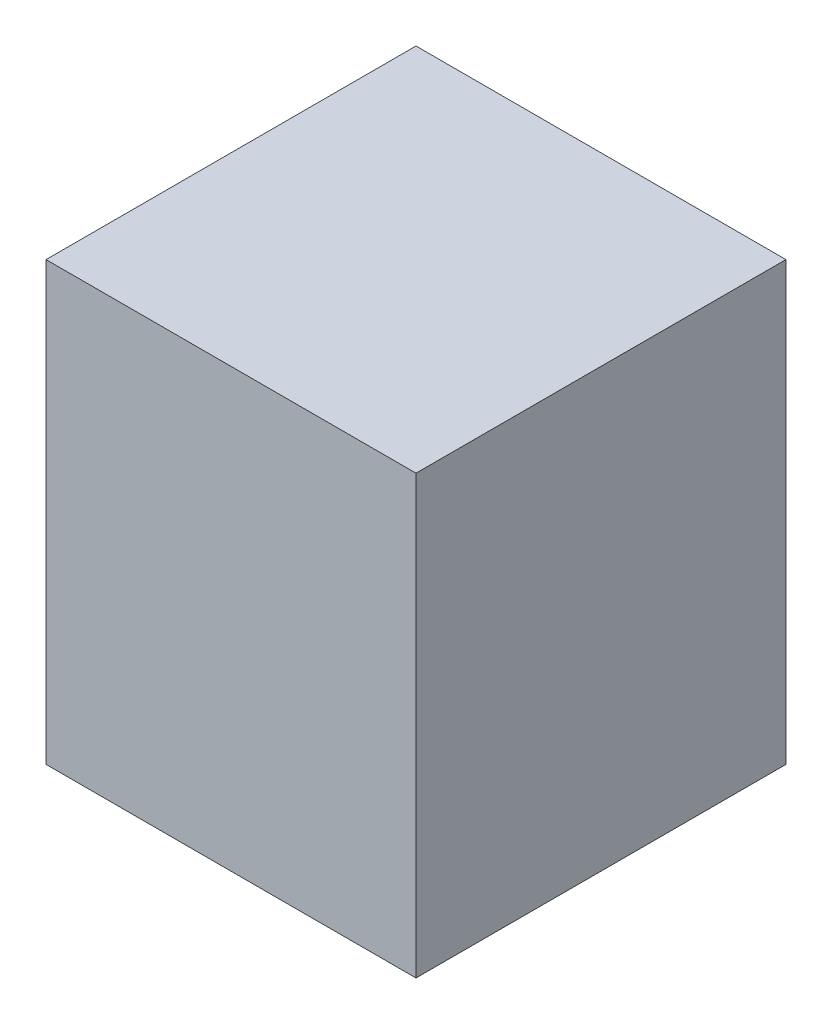
ISO-10303-21;
HEADER;
FILE_DESCRIPTION(('STEP AP214'),'2;1');
FILE_NAME('part.step','',(''),(''),'','','');
FILE_SCHEMA(('AUTOMOTIVE_DESIGN { 1 0 10303 214 1 1 1 1 }'));
ENDSEC;
DATA;
#1=APPLICATION_CONTEXT('core data for automotive mechanical design processes');
#2=APPLICATION_PROTOCOL_DEFINITION('international standard','automotive_design',2000,#1);
#3=PRODUCT_CONTEXT('',#1,'mechanical');
#4=PRODUCT('Part','Part','',(#3));
#5=PRODUCT_RELATED_PRODUCT_CATEGORY('part','',(#4));
#6=PRODUCT_DEFINITION_FORMATION('','',#4);
#7=PRODUCT_DEFINITION_CONTEXT('part definition',#1,'design');
#8=PRODUCT_DEFINITION('design','',#6,#7);
#9=PRODUCT_DEFINITION_SHAPE('','',#8);
#10=(LENGTH_UNIT() NAMED_UNIT(*) SI_UNIT(.MILLI.,.METRE.));
#11=(NAMED_UNIT(*) PLANE_ANGLE_UNIT() SI_UNIT($,.RADIAN.));
#12=(NAMED_UNIT(*) SI_UNIT($,.STERADIAN.) SOLID_ANGLE_UNIT());
#13=UNCERTAINTY_MEASURE_WITH_UNIT(LENGTH_MEASURE(1.E-05),#10,'distance_accuracy_value','');
#14=(GEOMETRIC_REPRESENTATION_CONTEXT(3) GLOBAL_UNCERTAINTY_ASSIGNED_CONTEXT((#13)) GLOBAL_UNIT_ASSIGNED_CONTEXT((#10,
#11,#12)) REPRESENTATION_CONTEXT('',''));
#15=CARTESIAN_POINT('',(0.,0.,0.));
#16=DIRECTION('',(0.,0.,1.));
#17=DIRECTION('',(1.,0.,0.));
#18=AXIS2_PLACEMENT_3D('',#15,#16,#17);
#19=CARTESIAN_POINT('',(27.5,32.5,0.));
#20=DIRECTION('',(0.707106781186546,0.,-0.707106781186549));
#21=DIRECTION('',(-0.707106781186549,0.,-0.707106781186546));
#22=AXIS2_PLACEMENT_3D('',#19,#20,#21);
#23=PLANE('',#22);
#24=DIRECTION('',(0.,1.,0.));
#25=VECTOR('',#24,1.);
#26=CARTESIAN_POINT('',(27.5,32.5,0.));
#27=LINE('',#26,#25);
#28=CARTESIAN_POINT('',(27.5,-32.5,0.));
#29=VERTEX_POINT('',#28);
#30=CARTESIAN_POINT('',(27.5,32.5,0.));
#31=VERTEX_POINT('',#30);
#32=EDGE_CURVE('E126',#29,#31,#27,.T.);
#33=ORIENTED_EDGE('',*,*,#32,.F.);
#34=DIRECTION('',(0.577350269189627,-0.577350269189627,0.577350269189624));
#35=VECTOR('',#34,1.);
#36=CARTESIAN_POINT('',(9.16666666666664,-14.1666666666666,-18.3333333333333));
#37=LINE('',#36,#35);
#38=CARTESIAN_POINT('',(17.5,-22.5,-10.));
#39=VERTEX_POINT('',#38);
#40=EDGE_CURVE('E11',#39,#29,#37,.T.);
#41=ORIENTED_EDGE('',*,*,#40,.F.);
#42=DIRECTION('',(0.,1.,0.));
#43=VECTOR('',#42,1.);
#44=CARTESIAN_POINT('',(17.5,0.,-10.));
#45=LINE('',#44,#43);
#46=CARTESIAN_POINT('',(17.5,22.5,-10.));
#47=VERTEX_POINT('',#46);
#48=EDGE_CURVE('E146',#39,#47,#45,.T.);
#49=ORIENTED_EDGE('',*,*,#48,.T.);
#50=DIRECTION('',(0.577350269189626,0.577350269189627,0.577350269189624));
#51=VECTOR('',#50,1.);
#52=CARTESIAN_POINT('',(27.5,32.5,0.));
#53=LINE('',#52,#51);
#54=EDGE_CURVE('E77',#47,#31,#53,.T.);
#55=ORIENTED_EDGE('',*,*,#54,.T.);
#56=EDGE_LOOP('',(#33,#41,#49,#55));
#57=FACE_BOUND('',#56,.T.);
#58=ADVANCED_FACE('F39',(#57),#23,.T.);
#59=CARTESIAN_POINT('',(-27.5,-32.5,0.));
#60=DIRECTION('',(0.,-0.707106781186546,-0.707106781186549));
#61=DIRECTION('',(0.,0.707106781186549,-0.707106781186546));
#62=AXIS2_PLACEMENT_3D('',#59,#60,#61);
#63=PLANE('',#62);
#64=DIRECTION('',(1.,0.,0.));
#65=VECTOR('',#64,1.);
#66=CARTESIAN_POINT('',(-27.5,-32.5,0.));
#67=LINE('',#66,#65);
#68=CARTESIAN_POINT('',(-27.5,-32.5,0.));
#69=VERTEX_POINT('',#68);
#70=EDGE_CURVE('E143',#69,#29,#67,.T.);
#71=ORIENTED_EDGE('',*,*,#70,.F.);
#72=DIRECTION('',(-0.577350269189626,-0.577350269189627,0.577350269189624));
#73=VECTOR('',#72,1.);
#74=CARTESIAN_POINT('',(-5.83333333333327,-10.8333333333333,-21.6666666666666));
#75=LINE('',#74,#73);
#76=CARTESIAN_POINT('',(-17.5,-22.5,-10.));
#77=VERTEX_POINT('',#76);
#78=EDGE_CURVE('E50',#77,#69,#75,.T.);
#79=ORIENTED_EDGE('',*,*,#78,.F.);
#80=DIRECTION('',(1.,0.,0.));
#81=VECTOR('',#80,1.);
#82=CARTESIAN_POINT('',(0.,-22.5,-10.));
#83=LINE('',#82,#81);
#84=EDGE_CURVE('E150',#77,#39,#83,.T.);
#85=ORIENTED_EDGE('',*,*,#84,.T.);
#86=ORIENTED_EDGE('',*,*,#40,.T.);
#87=EDGE_LOOP('',(#71,#79,#85,#86));
#88=FACE_BOUND('',#87,.T.);
#89=ADVANCED_FACE('F41',(#88),#63,.T.);
#90=CARTESIAN_POINT('',(-27.5,32.5,0.));
#91=DIRECTION('',(-0.707106781186546,0.,-0.707106781186549));
#92=DIRECTION('',(-0.707106781186549,0.,0.707106781186546));
#93=AXIS2_PLACEMENT_3D('',#90,#91,#92);
#94=PLANE('',#93);
#95=DIRECTION('',(0.,-1.,0.));
#96=VECTOR('',#95,1.);
#97=CARTESIAN_POINT('',(-27.5,32.5,0.));
#98=LINE('',#97,#96);
#99=CARTESIAN_POINT('',(-27.5,32.5,0.));
#100=VERTEX_POINT('',#99);
#101=EDGE_CURVE('E139',#100,#69,#98,.T.);
#102=ORIENTED_EDGE('',*,*,#101,.F.);
#103=DIRECTION('',(-0.577350269189627,0.577350269189627,0.577350269189624));
#104=VECTOR('',#103,1.);
#105=CARTESIAN_POINT('',(-27.5,32.5,0.));
#106=LINE('',#105,#104);
#107=CARTESIAN_POINT('',(-17.5,22.5,-10.));
#108=VERTEX_POINT('',#107);
#109=EDGE_CURVE('E70',#108,#100,#106,.T.);
#110=ORIENTED_EDGE('',*,*,#109,.F.);
#111=DIRECTION('',(0.,-1.,0.));
#112=VECTOR('',#111,1.);
#113=CARTESIAN_POINT('',(-17.5,0.,-10.));
#114=LINE('',#113,#112);
#115=EDGE_CURVE('E159',#108,#77,#114,.T.);
#116=ORIENTED_EDGE('',*,*,#115,.T.);
#117=ORIENTED_EDGE('',*,*,#78,.T.);
#118=EDGE_LOOP('',(#102,#110,#116,#117));
#119=FACE_BOUND('',#118,.T.);
#120=ADVANCED_FACE('F182',(#119),#94,.T.);
#121=CARTESIAN_POINT('',(-27.5,32.5,0.));
#122=DIRECTION('',(0.,0.707106781186546,-0.707106781186549));
#123=DIRECTION('',(0.,0.707106781186549,0.707106781186546));
#124=AXIS2_PLACEMENT_3D('',#121,#122,#123);
#125=PLANE('',#124);
#126=DIRECTION('',(-1.,0.,0.));
#127=VECTOR('',#126,1.);
#128=CARTESIAN_POINT('',(-27.5,32.5,0.));
#129=LINE('',#128,#127);
#130=EDGE_CURVE('E131',#31,#100,#129,.T.);
#131=ORIENTED_EDGE('',*,*,#130,.F.);
#132=ORIENTED_EDGE('',*,*,#54,.F.);
#133=DIRECTION('',(-1.,0.,0.));
#134=VECTOR('',#133,1.);
#135=CARTESIAN_POINT('',(0.,22.5,-10.));
#136=LINE('',#135,#134);
#137=EDGE_CURVE('E43',#47,#108,#136,.T.);
#138=ORIENTED_EDGE('',*,*,#137,.T.);
#139=ORIENTED_EDGE('',*,*,#109,.T.);
#140=EDGE_LOOP('',(#131,#132,#138,#139));
#141=FACE_BOUND('',#140,.T.);
#142=ADVANCED_FACE('F163',(#141),#125,.T.);
#143=CARTESIAN_POINT('',(0.,0.,-10.));
#144=DIRECTION('',(0.,0.,1.));
#145=DIRECTION('',(1.,0.,0.));
#146=AXIS2_PLACEMENT_3D('',#143,#144,#145);
#147=PLANE('',#146);
#148=ORIENTED_EDGE('',*,*,#48,.F.);
#149=ORIENTED_EDGE('',*,*,#84,.F.);
#150=ORIENTED_EDGE('',*,*,#115,.F.);
#151=ORIENTED_EDGE('',*,*,#137,.F.);
#152=EDGE_LOOP('',(#148,#149,#150,#151));
#153=FACE_BOUND('',#152,.T.);
#154=ADVANCED_FACE('F165',(#153),#147,.F.);
#155=CARTESIAN_POINT('',(27.5,32.5,55.));
#156=DIRECTION('',(-1.,0.,0.));
#157=DIRECTION('',(0.,-1.,0.));
#158=AXIS2_PLACEMENT_3D('',#155,#156,#157);
#159=PLANE('',#158);
#160=ORIENTED_EDGE('',*,*,#32,.T.);
#161=DIRECTION('',(0.,0.,-1.));
#162=VECTOR('',#161,1.);
#163=CARTESIAN_POINT('',(27.5,32.5,55.));
#164=LINE('',#163,#162);
#165=CARTESIAN_POINT('',(27.5,32.5,55.));
#166=VERTEX_POINT('',#165);
#167=EDGE_CURVE('E106',#166,#31,#164,.T.);
#168=ORIENTED_EDGE('',*,*,#167,.F.);
#169=DIRECTION('',(0.,1.,0.));
#170=VECTOR('',#169,1.);
#171=CARTESIAN_POINT('',(27.5,32.5,55.));
#172=LINE('',#171,#170);
#173=CARTESIAN_POINT('',(27.5,-32.5,55.));
#174=VERTEX_POINT('',#173);
#175=EDGE_CURVE('E114',#174,#166,#172,.T.);
#176=ORIENTED_EDGE('',*,*,#175,.F.);
#177=DIRECTION('',(0.,0.,-1.));
#178=VECTOR('',#177,1.);
#179=CARTESIAN_POINT('',(27.5,-32.5,55.));
#180=LINE('',#179,#178);
#181=EDGE_CURVE('E173',#174,#29,#180,.T.);
#182=ORIENTED_EDGE('',*,*,#181,.T.);
#183=EDGE_LOOP('',(#160,#168,#176,#182));
#184=FACE_BOUND('',#183,.T.);
#185=ADVANCED_FACE('F125',(#184),#159,.F.);
#186=CARTESIAN_POINT('',(-27.5,32.5,55.));
#187=DIRECTION('',(0.,-1.,0.));
#188=DIRECTION('',(0.,0.,-1.));
#189=AXIS2_PLACEMENT_3D('',#186,#187,#188);
#190=PLANE('',#189);
#191=ORIENTED_EDGE('',*,*,#130,.T.);
#192=DIRECTION('',(0.,0.,-1.));
#193=VECTOR('',#192,1.);
#194=CARTESIAN_POINT('',(-27.5,32.5,55.));
#195=LINE('',#194,#193);
#196=CARTESIAN_POINT('',(-27.5,32.5,55.));
#197=VERTEX_POINT('',#196);
#198=EDGE_CURVE('E109',#197,#100,#195,.T.);
#199=ORIENTED_EDGE('',*,*,#198,.F.);
#200=DIRECTION('',(-1.,0.,0.));
#201=VECTOR('',#200,1.);
#202=CARTESIAN_POINT('',(-27.5,32.5,55.));
#203=LINE('',#202,#201);
#204=EDGE_CURVE('E101',#166,#197,#203,.T.);
#205=ORIENTED_EDGE('',*,*,#204,.F.);
#206=ORIENTED_EDGE('',*,*,#167,.T.);
#207=EDGE_LOOP('',(#191,#199,#205,#206));
#208=FACE_BOUND('',#207,.T.);
#209=ADVANCED_FACE('F104',(#208),#190,.F.);
#210=CARTESIAN_POINT('',(-27.5,32.5,55.));
#211=DIRECTION('',(1.,0.,0.));
#212=DIRECTION('',(0.,1.,0.));
#213=AXIS2_PLACEMENT_3D('',#210,#211,#212);
#214=PLANE('',#213);
#215=ORIENTED_EDGE('',*,*,#101,.T.);
#216=DIRECTION('',(0.,0.,-1.));
#217=VECTOR('',#216,1.);
#218=CARTESIAN_POINT('',(-27.5,-32.5,55.));
#219=LINE('',#218,#217);
#220=CARTESIAN_POINT('',(-27.5,-32.5,55.));
#221=VERTEX_POINT('',#220);
#222=EDGE_CURVE('E133',#221,#69,#219,.T.);
#223=ORIENTED_EDGE('',*,*,#222,.F.);
#224=DIRECTION('',(0.,-1.,0.));
#225=VECTOR('',#224,1.);
#226=CARTESIAN_POINT('',(-27.5,32.5,55.));
#227=LINE('',#226,#225);
#228=EDGE_CURVE('E113',#197,#221,#227,.T.);
#229=ORIENTED_EDGE('',*,*,#228,.F.);
#230=ORIENTED_EDGE('',*,*,#198,.T.);
#231=EDGE_LOOP('',(#215,#223,#229,#230));
#232=FACE_BOUND('',#231,.T.);
#233=ADVANCED_FACE('F167',(#232),#214,.F.);
#234=CARTESIAN_POINT('',(-27.5,-32.5,55.));
#235=DIRECTION('',(0.,1.,0.));
#236=DIRECTION('',(0.,0.,1.));
#237=AXIS2_PLACEMENT_3D('',#234,#235,#236);
#238=PLANE('',#237);
#239=ORIENTED_EDGE('',*,*,#70,.T.);
#240=ORIENTED_EDGE('',*,*,#181,.F.);
#241=DIRECTION('',(1.,0.,0.));
#242=VECTOR('',#241,1.);
#243=CARTESIAN_POINT('',(-27.5,-32.5,55.));
#244=LINE('',#243,#242);
#245=EDGE_CURVE('E119',#221,#174,#244,.T.);
#246=ORIENTED_EDGE('',*,*,#245,.F.);
#247=ORIENTED_EDGE('',*,*,#222,.T.);
#248=EDGE_LOOP('',(#239,#240,#246,#247));
#249=FACE_BOUND('',#248,.T.);
#250=ADVANCED_FACE('F179',(#249),#238,.F.);
#251=CARTESIAN_POINT('',(0.,0.,55.));
#252=DIRECTION('',(0.,0.,1.));
#253=DIRECTION('',(1.,0.,0.));
#254=AXIS2_PLACEMENT_3D('',#251,#252,#253);
#255=PLANE('',#254);
#256=ORIENTED_EDGE('',*,*,#175,.T.);
#257=ORIENTED_EDGE('',*,*,#204,.T.);
#258=ORIENTED_EDGE('',*,*,#228,.T.);
#259=ORIENTED_EDGE('',*,*,#245,.T.);
#260=EDGE_LOOP('',(#256,#257,#258,#259));
#261=FACE_BOUND('',#260,.T.);
#262=ADVANCED_FACE('F117',(#261),#255,.T.);
#263=CLOSED_SHELL('',(#58,#89,#120,#142,#154,#185,#209,#233,#250,#262));
#264=MANIFOLD_SOLID_BREP('B2',#263);
#265=ADVANCED_BREP_SHAPE_REPRESENTATION('',(#18,#264),#14);
#266=SHAPE_DEFINITION_REPRESENTATION(#9,#265);
ENDSEC;
END-ISO-10303-21;
